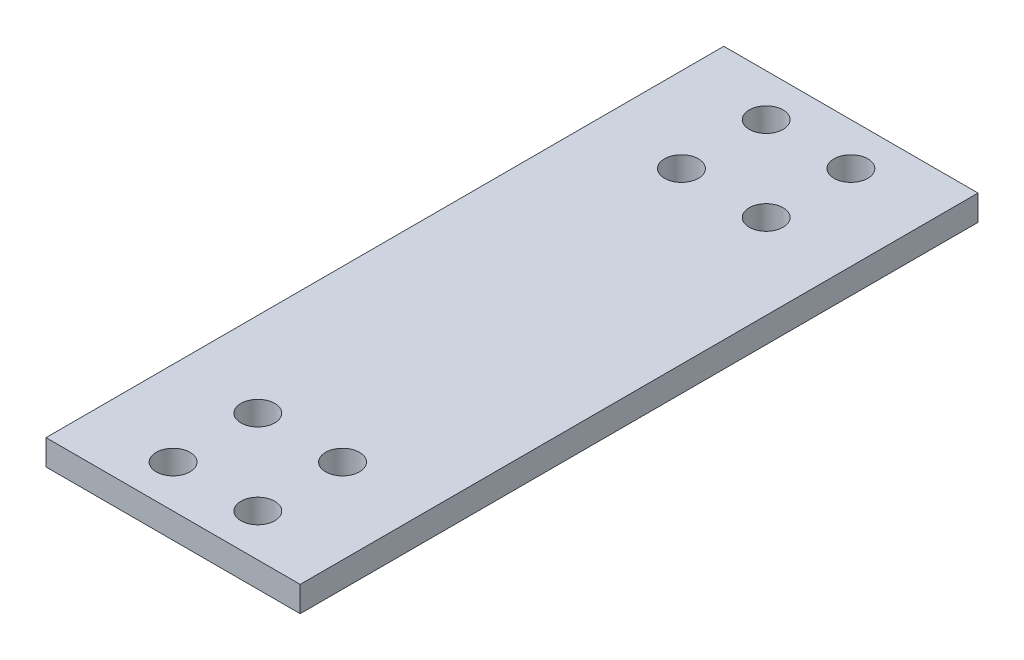
ISO-10303-21;
HEADER;
FILE_DESCRIPTION(('STEP AP214'),'2;1');
FILE_NAME('part.step','',(''),(''),'','','');
FILE_SCHEMA(('AUTOMOTIVE_DESIGN { 1 0 10303 214 1 1 1 1 }'));
ENDSEC;
DATA;
#1=APPLICATION_CONTEXT('core data for automotive mechanical design processes');
#2=APPLICATION_PROTOCOL_DEFINITION('international standard','automotive_design',2000,#1);
#3=PRODUCT_CONTEXT('',#1,'mechanical');
#4=PRODUCT('Part','Part','',(#3));
#5=PRODUCT_RELATED_PRODUCT_CATEGORY('part','',(#4));
#6=PRODUCT_DEFINITION_FORMATION('','',#4);
#7=PRODUCT_DEFINITION_CONTEXT('part definition',#1,'design');
#8=PRODUCT_DEFINITION('design','',#6,#7);
#9=PRODUCT_DEFINITION_SHAPE('','',#8);
#10=(LENGTH_UNIT() NAMED_UNIT(*) SI_UNIT(.MILLI.,.METRE.));
#11=(NAMED_UNIT(*) PLANE_ANGLE_UNIT() SI_UNIT($,.RADIAN.));
#12=(NAMED_UNIT(*) SI_UNIT($,.STERADIAN.) SOLID_ANGLE_UNIT());
#13=UNCERTAINTY_MEASURE_WITH_UNIT(LENGTH_MEASURE(1.E-05),#10,'distance_accuracy_value','');
#14=(GEOMETRIC_REPRESENTATION_CONTEXT(3) GLOBAL_UNCERTAINTY_ASSIGNED_CONTEXT((#13)) GLOBAL_UNIT_ASSIGNED_CONTEXT((#10,
#11,#12)) REPRESENTATION_CONTEXT('',''));
#15=CARTESIAN_POINT('',(0.,0.,0.));
#16=DIRECTION('',(0.,0.,1.));
#17=DIRECTION('',(1.,0.,0.));
#18=AXIS2_PLACEMENT_3D('',#15,#16,#17);
#19=CARTESIAN_POINT('',(0.,3.,0.));
#20=DIRECTION('',(0.,1.,0.));
#21=DIRECTION('',(0.,0.,1.));
#22=AXIS2_PLACEMENT_3D('',#19,#20,#21);
#23=PLANE('',#22);
#24=DIRECTION('',(0.,0.,1.));
#25=VECTOR('',#24,1.);
#26=CARTESIAN_POINT('',(15.,3.,0.));
#27=LINE('',#26,#25);
#28=CARTESIAN_POINT('',(15.,3.,-40.));
#29=VERTEX_POINT('',#28);
#30=CARTESIAN_POINT('',(15.,3.,40.));
#31=VERTEX_POINT('',#30);
#32=EDGE_CURVE('E76',#29,#31,#27,.T.);
#33=ORIENTED_EDGE('',*,*,#32,.F.);
#34=DIRECTION('',(-1.,0.,0.));
#35=VECTOR('',#34,1.);
#36=CARTESIAN_POINT('',(0.,3.,-40.));
#37=LINE('',#36,#35);
#38=CARTESIAN_POINT('',(-15.,3.,-40.));
#39=VERTEX_POINT('',#38);
#40=EDGE_CURVE('E54',#29,#39,#37,.T.);
#41=ORIENTED_EDGE('',*,*,#40,.T.);
#42=DIRECTION('',(0.,0.,1.));
#43=VECTOR('',#42,1.);
#44=CARTESIAN_POINT('',(-15.,3.,0.));
#45=LINE('',#44,#43);
#46=CARTESIAN_POINT('',(-15.,3.,40.));
#47=VERTEX_POINT('',#46);
#48=EDGE_CURVE('E48',#39,#47,#45,.T.);
#49=ORIENTED_EDGE('',*,*,#48,.T.);
#50=DIRECTION('',(-1.,0.,0.));
#51=VECTOR('',#50,1.);
#52=CARTESIAN_POINT('',(0.,3.,40.));
#53=LINE('',#52,#51);
#54=EDGE_CURVE('E87',#31,#47,#53,.T.);
#55=ORIENTED_EDGE('',*,*,#54,.F.);
#56=EDGE_LOOP('',(#33,#41,#49,#55));
#57=FACE_BOUND('',#56,.T.);
#58=CARTESIAN_POINT('',(-5.,3.,-35.));
#59=DIRECTION('',(0.,1.,0.));
#60=DIRECTION('',(0.,0.,1.));
#61=AXIS2_PLACEMENT_3D('',#58,#59,#60);
#62=CIRCLE('',#61,2.);
#63=CARTESIAN_POINT('',(-5.,3.,-33.));
#64=VERTEX_POINT('',#63);
#65=EDGE_CURVE('E141',#64,#64,#62,.T.);
#66=ORIENTED_EDGE('',*,*,#65,.F.);
#67=EDGE_LOOP('',(#66));
#68=FACE_BOUND('',#67,.T.);
#69=CARTESIAN_POINT('',(-5.,3.,-25.));
#70=DIRECTION('',(0.,1.,0.));
#71=DIRECTION('',(0.,0.,1.));
#72=AXIS2_PLACEMENT_3D('',#69,#70,#71);
#73=CIRCLE('',#72,2.);
#74=CARTESIAN_POINT('',(-5.,3.,-23.));
#75=VERTEX_POINT('',#74);
#76=EDGE_CURVE('E135',#75,#75,#73,.T.);
#77=ORIENTED_EDGE('',*,*,#76,.F.);
#78=EDGE_LOOP('',(#77));
#79=FACE_BOUND('',#78,.T.);
#80=CARTESIAN_POINT('',(5.,3.,-35.));
#81=DIRECTION('',(0.,-1.,0.));
#82=DIRECTION('',(0.,0.,1.));
#83=AXIS2_PLACEMENT_3D('',#80,#81,#82);
#84=CIRCLE('',#83,2.);
#85=CARTESIAN_POINT('',(5.,3.,-33.));
#86=VERTEX_POINT('',#85);
#87=EDGE_CURVE('E127',#86,#86,#84,.T.);
#88=ORIENTED_EDGE('',*,*,#87,.T.);
#89=EDGE_LOOP('',(#88));
#90=FACE_BOUND('',#89,.T.);
#91=CARTESIAN_POINT('',(5.,3.,-25.));
#92=DIRECTION('',(0.,-1.,0.));
#93=DIRECTION('',(0.,0.,1.));
#94=AXIS2_PLACEMENT_3D('',#91,#92,#93);
#95=CIRCLE('',#94,2.);
#96=CARTESIAN_POINT('',(5.,3.,-23.));
#97=VERTEX_POINT('',#96);
#98=EDGE_CURVE('E121',#97,#97,#95,.T.);
#99=ORIENTED_EDGE('',*,*,#98,.T.);
#100=EDGE_LOOP('',(#99));
#101=FACE_BOUND('',#100,.T.);
#102=CARTESIAN_POINT('',(-4.99999999999999,3.,35.));
#103=DIRECTION('',(0.,-1.,0.));
#104=DIRECTION('',(0.,0.,-1.));
#105=AXIS2_PLACEMENT_3D('',#102,#103,#104);
#106=CIRCLE('',#105,2.);
#107=CARTESIAN_POINT('',(-4.99999999999999,3.,33.));
#108=VERTEX_POINT('',#107);
#109=EDGE_CURVE('E113',#108,#108,#106,.T.);
#110=ORIENTED_EDGE('',*,*,#109,.T.);
#111=EDGE_LOOP('',(#110));
#112=FACE_BOUND('',#111,.T.);
#113=CARTESIAN_POINT('',(-4.99999999999999,3.,25.));
#114=DIRECTION('',(0.,-1.,0.));
#115=DIRECTION('',(0.,0.,-1.));
#116=AXIS2_PLACEMENT_3D('',#113,#114,#115);
#117=CIRCLE('',#116,2.);
#118=CARTESIAN_POINT('',(-4.99999999999999,3.,23.));
#119=VERTEX_POINT('',#118);
#120=EDGE_CURVE('E103',#119,#119,#117,.T.);
#121=ORIENTED_EDGE('',*,*,#120,.T.);
#122=EDGE_LOOP('',(#121));
#123=FACE_BOUND('',#122,.T.);
#124=CARTESIAN_POINT('',(4.99999999999999,3.,35.));
#125=DIRECTION('',(0.,1.,0.));
#126=DIRECTION('',(0.,0.,-1.));
#127=AXIS2_PLACEMENT_3D('',#124,#125,#126);
#128=CIRCLE('',#127,2.);
#129=CARTESIAN_POINT('',(4.99999999999999,3.,33.));
#130=VERTEX_POINT('',#129);
#131=EDGE_CURVE('E100',#130,#130,#128,.T.);
#132=ORIENTED_EDGE('',*,*,#131,.F.);
#133=EDGE_LOOP('',(#132));
#134=FACE_BOUND('',#133,.T.);
#135=CARTESIAN_POINT('',(4.99999999999999,3.,25.));
#136=DIRECTION('',(0.,1.,0.));
#137=DIRECTION('',(0.,0.,-1.));
#138=AXIS2_PLACEMENT_3D('',#135,#136,#137);
#139=CIRCLE('',#138,2.);
#140=CARTESIAN_POINT('',(4.99999999999999,3.,23.));
#141=VERTEX_POINT('',#140);
#142=EDGE_CURVE('E209',#141,#141,#139,.T.);
#143=ORIENTED_EDGE('',*,*,#142,.F.);
#144=EDGE_LOOP('',(#143));
#145=FACE_BOUND('',#144,.T.);
#146=ADVANCED_FACE('F39',(#57,#68,#79,#90,#101,#112,#123,#134,#145),#23,.T.);
#147=CARTESIAN_POINT('',(0.,0.,0.));
#148=DIRECTION('',(0.,1.,0.));
#149=DIRECTION('',(0.,0.,1.));
#150=AXIS2_PLACEMENT_3D('',#147,#148,#149);
#151=PLANE('',#150);
#152=DIRECTION('',(-1.,0.,0.));
#153=VECTOR('',#152,1.);
#154=CARTESIAN_POINT('',(0.,0.,-40.));
#155=LINE('',#154,#153);
#156=CARTESIAN_POINT('',(15.,0.,-40.));
#157=VERTEX_POINT('',#156);
#158=CARTESIAN_POINT('',(-15.,0.,-40.));
#159=VERTEX_POINT('',#158);
#160=EDGE_CURVE('E144',#157,#159,#155,.T.);
#161=ORIENTED_EDGE('',*,*,#160,.F.);
#162=DIRECTION('',(0.,0.,1.));
#163=VECTOR('',#162,1.);
#164=CARTESIAN_POINT('',(15.,0.,0.));
#165=LINE('',#164,#163);
#166=CARTESIAN_POINT('',(15.,0.,40.));
#167=VERTEX_POINT('',#166);
#168=EDGE_CURVE('E84',#157,#167,#165,.T.);
#169=ORIENTED_EDGE('',*,*,#168,.T.);
#170=DIRECTION('',(-1.,0.,0.));
#171=VECTOR('',#170,1.);
#172=CARTESIAN_POINT('',(0.,0.,40.));
#173=LINE('',#172,#171);
#174=CARTESIAN_POINT('',(-15.,0.,40.));
#175=VERTEX_POINT('',#174);
#176=EDGE_CURVE('E94',#167,#175,#173,.T.);
#177=ORIENTED_EDGE('',*,*,#176,.T.);
#178=DIRECTION('',(0.,0.,1.));
#179=VECTOR('',#178,1.);
#180=CARTESIAN_POINT('',(-15.,0.,0.));
#181=LINE('',#180,#179);
#182=EDGE_CURVE('E148',#159,#175,#181,.T.);
#183=ORIENTED_EDGE('',*,*,#182,.F.);
#184=EDGE_LOOP('',(#161,#169,#177,#183));
#185=FACE_BOUND('',#184,.T.);
#186=CARTESIAN_POINT('',(-5.,0.,-35.));
#187=DIRECTION('',(0.,1.,0.));
#188=DIRECTION('',(0.,0.,1.));
#189=AXIS2_PLACEMENT_3D('',#186,#187,#188);
#190=CIRCLE('',#189,2.);
#191=CARTESIAN_POINT('',(-5.,0.,-33.));
#192=VERTEX_POINT('',#191);
#193=EDGE_CURVE('E138',#192,#192,#190,.T.);
#194=ORIENTED_EDGE('',*,*,#193,.T.);
#195=EDGE_LOOP('',(#194));
#196=FACE_BOUND('',#195,.T.);
#197=CARTESIAN_POINT('',(-5.,0.,-25.));
#198=DIRECTION('',(0.,1.,0.));
#199=DIRECTION('',(0.,0.,1.));
#200=AXIS2_PLACEMENT_3D('',#197,#198,#199);
#201=CIRCLE('',#200,2.);
#202=CARTESIAN_POINT('',(-5.,0.,-23.));
#203=VERTEX_POINT('',#202);
#204=EDGE_CURVE('E134',#203,#203,#201,.T.);
#205=ORIENTED_EDGE('',*,*,#204,.T.);
#206=EDGE_LOOP('',(#205));
#207=FACE_BOUND('',#206,.T.);
#208=CARTESIAN_POINT('',(5.,0.,-35.));
#209=DIRECTION('',(0.,-1.,0.));
#210=DIRECTION('',(0.,0.,1.));
#211=AXIS2_PLACEMENT_3D('',#208,#209,#210);
#212=CIRCLE('',#211,2.);
#213=CARTESIAN_POINT('',(5.,0.,-33.));
#214=VERTEX_POINT('',#213);
#215=EDGE_CURVE('E124',#214,#214,#212,.T.);
#216=ORIENTED_EDGE('',*,*,#215,.F.);
#217=EDGE_LOOP('',(#216));
#218=FACE_BOUND('',#217,.T.);
#219=CARTESIAN_POINT('',(5.,0.,-25.));
#220=DIRECTION('',(0.,-1.,0.));
#221=DIRECTION('',(0.,0.,1.));
#222=AXIS2_PLACEMENT_3D('',#219,#220,#221);
#223=CIRCLE('',#222,2.);
#224=CARTESIAN_POINT('',(5.,0.,-23.));
#225=VERTEX_POINT('',#224);
#226=EDGE_CURVE('E120',#225,#225,#223,.T.);
#227=ORIENTED_EDGE('',*,*,#226,.F.);
#228=EDGE_LOOP('',(#227));
#229=FACE_BOUND('',#228,.T.);
#230=CARTESIAN_POINT('',(-4.99999999999999,0.,35.));
#231=DIRECTION('',(0.,-1.,0.));
#232=DIRECTION('',(0.,0.,-1.));
#233=AXIS2_PLACEMENT_3D('',#230,#231,#232);
#234=CIRCLE('',#233,2.);
#235=CARTESIAN_POINT('',(-4.99999999999999,0.,33.));
#236=VERTEX_POINT('',#235);
#237=EDGE_CURVE('E111',#236,#236,#234,.T.);
#238=ORIENTED_EDGE('',*,*,#237,.F.);
#239=EDGE_LOOP('',(#238));
#240=FACE_BOUND('',#239,.T.);
#241=CARTESIAN_POINT('',(-4.99999999999999,0.,25.));
#242=DIRECTION('',(0.,-1.,0.));
#243=DIRECTION('',(0.,0.,-1.));
#244=AXIS2_PLACEMENT_3D('',#241,#242,#243);
#245=CIRCLE('',#244,2.);
#246=CARTESIAN_POINT('',(-4.99999999999999,0.,23.));
#247=VERTEX_POINT('',#246);
#248=EDGE_CURVE('E99',#247,#247,#245,.T.);
#249=ORIENTED_EDGE('',*,*,#248,.F.);
#250=EDGE_LOOP('',(#249));
#251=FACE_BOUND('',#250,.T.);
#252=CARTESIAN_POINT('',(4.99999999999999,0.,35.));
#253=DIRECTION('',(0.,1.,0.));
#254=DIRECTION('',(0.,0.,-1.));
#255=AXIS2_PLACEMENT_3D('',#252,#253,#254);
#256=CIRCLE('',#255,2.);
#257=CARTESIAN_POINT('',(4.99999999999999,0.,33.));
#258=VERTEX_POINT('',#257);
#259=EDGE_CURVE('E106',#258,#258,#256,.T.);
#260=ORIENTED_EDGE('',*,*,#259,.T.);
#261=EDGE_LOOP('',(#260));
#262=FACE_BOUND('',#261,.T.);
#263=CARTESIAN_POINT('',(4.99999999999999,0.,25.));
#264=DIRECTION('',(0.,1.,0.));
#265=DIRECTION('',(0.,0.,-1.));
#266=AXIS2_PLACEMENT_3D('',#263,#264,#265);
#267=CIRCLE('',#266,2.);
#268=CARTESIAN_POINT('',(4.99999999999999,0.,23.));
#269=VERTEX_POINT('',#268);
#270=EDGE_CURVE('E212',#269,#269,#267,.T.);
#271=ORIENTED_EDGE('',*,*,#270,.T.);
#272=EDGE_LOOP('',(#271));
#273=FACE_BOUND('',#272,.T.);
#274=ADVANCED_FACE('F154',(#185,#196,#207,#218,#229,#240,#251,#262,#273),#151,.F.);
#275=CARTESIAN_POINT('',(0.,3.,-40.));
#276=DIRECTION('',(0.,0.,1.));
#277=DIRECTION('',(1.,0.,0.));
#278=AXIS2_PLACEMENT_3D('',#275,#276,#277);
#279=PLANE('',#278);
#280=ORIENTED_EDGE('',*,*,#160,.T.);
#281=DIRECTION('',(0.,-1.,0.));
#282=VECTOR('',#281,1.);
#283=CARTESIAN_POINT('',(-15.,3.,-40.));
#284=LINE('',#283,#282);
#285=EDGE_CURVE('E11',#39,#159,#284,.T.);
#286=ORIENTED_EDGE('',*,*,#285,.F.);
#287=ORIENTED_EDGE('',*,*,#40,.F.);
#288=DIRECTION('',(0.,-1.,0.));
#289=VECTOR('',#288,1.);
#290=CARTESIAN_POINT('',(15.,3.,-40.));
#291=LINE('',#290,#289);
#292=EDGE_CURVE('E83',#29,#157,#291,.T.);
#293=ORIENTED_EDGE('',*,*,#292,.T.);
#294=EDGE_LOOP('',(#280,#286,#287,#293));
#295=FACE_BOUND('',#294,.T.);
#296=ADVANCED_FACE('F41',(#295),#279,.F.);
#297=CARTESIAN_POINT('',(-15.,3.,0.));
#298=DIRECTION('',(1.,0.,0.));
#299=DIRECTION('',(0.,0.,-1.));
#300=AXIS2_PLACEMENT_3D('',#297,#298,#299);
#301=PLANE('',#300);
#302=ORIENTED_EDGE('',*,*,#182,.T.);
#303=DIRECTION('',(0.,-1.,0.));
#304=VECTOR('',#303,1.);
#305=CARTESIAN_POINT('',(-15.,3.,40.));
#306=LINE('',#305,#304);
#307=EDGE_CURVE('E93',#47,#175,#306,.T.);
#308=ORIENTED_EDGE('',*,*,#307,.F.);
#309=ORIENTED_EDGE('',*,*,#48,.F.);
#310=ORIENTED_EDGE('',*,*,#285,.T.);
#311=EDGE_LOOP('',(#302,#308,#309,#310));
#312=FACE_BOUND('',#311,.T.);
#313=ADVANCED_FACE('F152',(#312),#301,.F.);
#314=CARTESIAN_POINT('',(-5.,3.,-35.));
#315=DIRECTION('',(0.,-1.,0.));
#316=DIRECTION('',(0.,0.,-1.));
#317=AXIS2_PLACEMENT_3D('',#314,#315,#316);
#318=CYLINDRICAL_SURFACE('',#317,2.);
#319=ORIENTED_EDGE('',*,*,#65,.T.);
#320=EDGE_LOOP('',(#319));
#321=FACE_BOUND('',#320,.T.);
#322=ORIENTED_EDGE('',*,*,#193,.F.);
#323=EDGE_LOOP('',(#322));
#324=FACE_BOUND('',#323,.T.);
#325=ADVANCED_FACE('F162',(#321,#324),#318,.F.);
#326=CARTESIAN_POINT('',(-5.,3.,-25.));
#327=DIRECTION('',(0.,-1.,0.));
#328=DIRECTION('',(0.,0.,-1.));
#329=AXIS2_PLACEMENT_3D('',#326,#327,#328);
#330=CYLINDRICAL_SURFACE('',#329,2.);
#331=ORIENTED_EDGE('',*,*,#76,.T.);
#332=EDGE_LOOP('',(#331));
#333=FACE_BOUND('',#332,.T.);
#334=ORIENTED_EDGE('',*,*,#204,.F.);
#335=EDGE_LOOP('',(#334));
#336=FACE_BOUND('',#335,.T.);
#337=ADVANCED_FACE('F172',(#333,#336),#330,.F.);
#338=CARTESIAN_POINT('',(15.,3.,0.));
#339=DIRECTION('',(-1.,0.,0.));
#340=DIRECTION('',(0.,0.,-1.));
#341=AXIS2_PLACEMENT_3D('',#338,#339,#340);
#342=PLANE('',#341);
#343=ORIENTED_EDGE('',*,*,#168,.F.);
#344=ORIENTED_EDGE('',*,*,#292,.F.);
#345=ORIENTED_EDGE('',*,*,#32,.T.);
#346=DIRECTION('',(0.,-1.,0.));
#347=VECTOR('',#346,1.);
#348=CARTESIAN_POINT('',(15.,3.,40.));
#349=LINE('',#348,#347);
#350=EDGE_CURVE('E81',#31,#167,#349,.T.);
#351=ORIENTED_EDGE('',*,*,#350,.T.);
#352=EDGE_LOOP('',(#343,#344,#345,#351));
#353=FACE_BOUND('',#352,.T.);
#354=ADVANCED_FACE('F79',(#353),#342,.F.);
#355=CARTESIAN_POINT('',(5.,3.,-35.));
#356=DIRECTION('',(0.,-1.,0.));
#357=DIRECTION('',(0.,0.,-1.));
#358=AXIS2_PLACEMENT_3D('',#355,#356,#357);
#359=CYLINDRICAL_SURFACE('',#358,2.);
#360=ORIENTED_EDGE('',*,*,#87,.F.);
#361=EDGE_LOOP('',(#360));
#362=FACE_BOUND('',#361,.T.);
#363=ORIENTED_EDGE('',*,*,#215,.T.);
#364=EDGE_LOOP('',(#363));
#365=FACE_BOUND('',#364,.T.);
#366=ADVANCED_FACE('F179',(#362,#365),#359,.F.);
#367=CARTESIAN_POINT('',(5.,3.,-25.));
#368=DIRECTION('',(0.,-1.,0.));
#369=DIRECTION('',(0.,0.,-1.));
#370=AXIS2_PLACEMENT_3D('',#367,#368,#369);
#371=CYLINDRICAL_SURFACE('',#370,2.);
#372=ORIENTED_EDGE('',*,*,#98,.F.);
#373=EDGE_LOOP('',(#372));
#374=FACE_BOUND('',#373,.T.);
#375=ORIENTED_EDGE('',*,*,#226,.T.);
#376=EDGE_LOOP('',(#375));
#377=FACE_BOUND('',#376,.T.);
#378=ADVANCED_FACE('F182',(#374,#377),#371,.F.);
#379=CARTESIAN_POINT('',(0.,3.,40.));
#380=DIRECTION('',(0.,0.,-1.));
#381=DIRECTION('',(1.,0.,0.));
#382=AXIS2_PLACEMENT_3D('',#379,#380,#381);
#383=PLANE('',#382);
#384=ORIENTED_EDGE('',*,*,#176,.F.);
#385=ORIENTED_EDGE('',*,*,#350,.F.);
#386=ORIENTED_EDGE('',*,*,#54,.T.);
#387=ORIENTED_EDGE('',*,*,#307,.T.);
#388=EDGE_LOOP('',(#384,#385,#386,#387));
#389=FACE_BOUND('',#388,.T.);
#390=ADVANCED_FACE('F97',(#389),#383,.F.);
#391=CARTESIAN_POINT('',(-4.99999999999999,3.,35.));
#392=DIRECTION('',(0.,-1.,0.));
#393=DIRECTION('',(0.,0.,1.));
#394=AXIS2_PLACEMENT_3D('',#391,#392,#393);
#395=CYLINDRICAL_SURFACE('',#394,2.);
#396=ORIENTED_EDGE('',*,*,#109,.F.);
#397=EDGE_LOOP('',(#396));
#398=FACE_BOUND('',#397,.T.);
#399=ORIENTED_EDGE('',*,*,#237,.T.);
#400=EDGE_LOOP('',(#399));
#401=FACE_BOUND('',#400,.T.);
#402=ADVANCED_FACE('F189',(#398,#401),#395,.F.);
#403=CARTESIAN_POINT('',(-4.99999999999999,3.,25.));
#404=DIRECTION('',(0.,-1.,0.));
#405=DIRECTION('',(0.,0.,1.));
#406=AXIS2_PLACEMENT_3D('',#403,#404,#405);
#407=CYLINDRICAL_SURFACE('',#406,2.);
#408=ORIENTED_EDGE('',*,*,#120,.F.);
#409=EDGE_LOOP('',(#408));
#410=FACE_BOUND('',#409,.T.);
#411=ORIENTED_EDGE('',*,*,#248,.T.);
#412=EDGE_LOOP('',(#411));
#413=FACE_BOUND('',#412,.T.);
#414=ADVANCED_FACE('F192',(#410,#413),#407,.F.);
#415=CARTESIAN_POINT('',(4.99999999999999,3.,35.));
#416=DIRECTION('',(0.,-1.,0.));
#417=DIRECTION('',(0.,0.,1.));
#418=AXIS2_PLACEMENT_3D('',#415,#416,#417);
#419=CYLINDRICAL_SURFACE('',#418,2.);
#420=ORIENTED_EDGE('',*,*,#131,.T.);
#421=EDGE_LOOP('',(#420));
#422=FACE_BOUND('',#421,.T.);
#423=ORIENTED_EDGE('',*,*,#259,.F.);
#424=EDGE_LOOP('',(#423));
#425=FACE_BOUND('',#424,.T.);
#426=ADVANCED_FACE('F196',(#422,#425),#419,.F.);
#427=CARTESIAN_POINT('',(4.99999999999999,3.,25.));
#428=DIRECTION('',(0.,-1.,0.));
#429=DIRECTION('',(0.,0.,1.));
#430=AXIS2_PLACEMENT_3D('',#427,#428,#429);
#431=CYLINDRICAL_SURFACE('',#430,2.);
#432=ORIENTED_EDGE('',*,*,#142,.T.);
#433=EDGE_LOOP('',(#432));
#434=FACE_BOUND('',#433,.T.);
#435=ORIENTED_EDGE('',*,*,#270,.F.);
#436=EDGE_LOOP('',(#435));
#437=FACE_BOUND('',#436,.T.);
#438=ADVANCED_FACE('F200',(#434,#437),#431,.F.);
#439=CLOSED_SHELL('',(#146,#274,#296,#313,#325,#337,#354,#366,#378,#390,#402,#414,#426,#438));
#440=MANIFOLD_SOLID_BREP('B2',#439);
#441=ADVANCED_BREP_SHAPE_REPRESENTATION('',(#18,#440),#14);
#442=SHAPE_DEFINITION_REPRESENTATION(#9,#441);
ENDSEC;
END-ISO-10303-21;
